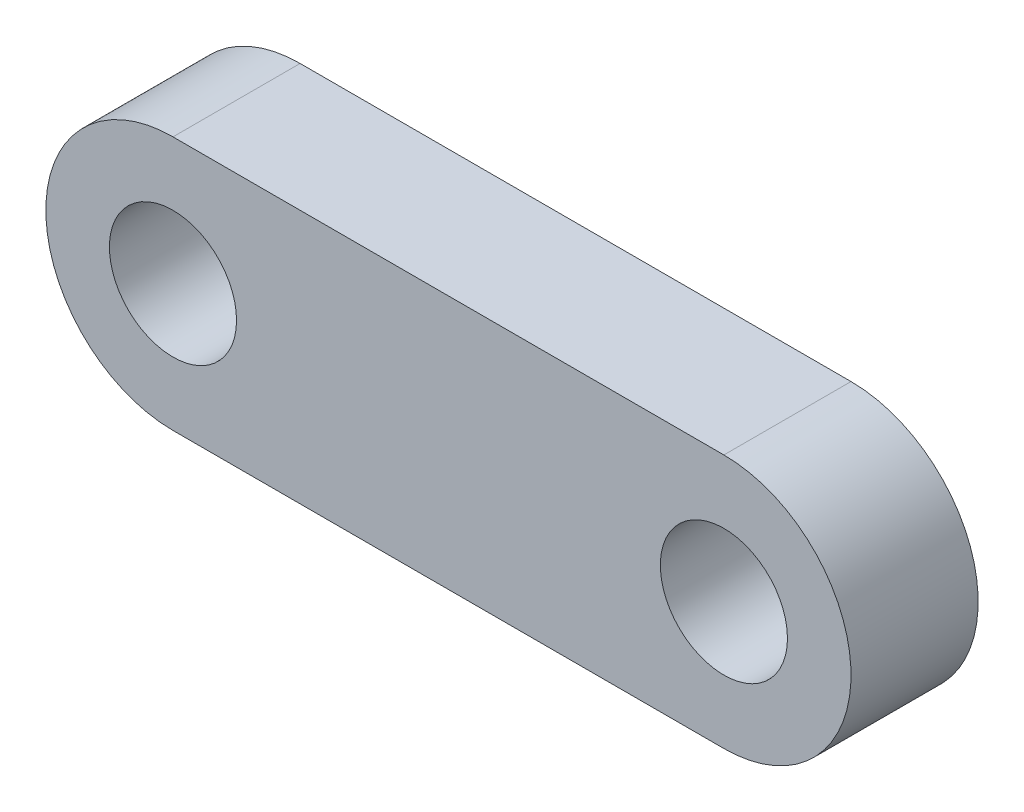
ISO-10303-21;
HEADER;
FILE_DESCRIPTION(('STEP AP214'),'2;1');
FILE_NAME('part.step','',(''),(''),'','','');
FILE_SCHEMA(('AUTOMOTIVE_DESIGN { 1 0 10303 214 1 1 1 1 }'));
ENDSEC;
DATA;
#1=APPLICATION_CONTEXT('core data for automotive mechanical design processes');
#2=APPLICATION_PROTOCOL_DEFINITION('international standard','automotive_design',2000,#1);
#3=PRODUCT_CONTEXT('',#1,'mechanical');
#4=PRODUCT('Part','Part','',(#3));
#5=PRODUCT_RELATED_PRODUCT_CATEGORY('part','',(#4));
#6=PRODUCT_DEFINITION_FORMATION('','',#4);
#7=PRODUCT_DEFINITION_CONTEXT('part definition',#1,'design');
#8=PRODUCT_DEFINITION('design','',#6,#7);
#9=PRODUCT_DEFINITION_SHAPE('','',#8);
#10=(LENGTH_UNIT() NAMED_UNIT(*) SI_UNIT(.MILLI.,.METRE.));
#11=(NAMED_UNIT(*) PLANE_ANGLE_UNIT() SI_UNIT($,.RADIAN.));
#12=(NAMED_UNIT(*) SI_UNIT($,.STERADIAN.) SOLID_ANGLE_UNIT());
#13=UNCERTAINTY_MEASURE_WITH_UNIT(LENGTH_MEASURE(1.E-05),#10,'distance_accuracy_value','');
#14=(GEOMETRIC_REPRESENTATION_CONTEXT(3) GLOBAL_UNCERTAINTY_ASSIGNED_CONTEXT((#13)) GLOBAL_UNIT_ASSIGNED_CONTEXT((#10,
#11,#12)) REPRESENTATION_CONTEXT('',''));
#15=CARTESIAN_POINT('',(0.,0.,0.));
#16=DIRECTION('',(0.,0.,1.));
#17=DIRECTION('',(1.,0.,0.));
#18=AXIS2_PLACEMENT_3D('',#15,#16,#17);
#19=CARTESIAN_POINT('',(0.,0.,1.5));
#20=DIRECTION('',(0.,0.,1.));
#21=DIRECTION('',(1.,0.,0.));
#22=AXIS2_PLACEMENT_3D('',#19,#20,#21);
#23=PLANE('',#22);
#24=CARTESIAN_POINT('',(-13.,0.,1.5));
#25=DIRECTION('',(0.,0.,1.));
#26=DIRECTION('',(1.,0.,0.));
#27=AXIS2_PLACEMENT_3D('',#24,#25,#26);
#28=CIRCLE('',#27,1.5);
#29=CARTESIAN_POINT('',(-11.5,0.,1.5));
#30=VERTEX_POINT('',#29);
#31=EDGE_CURVE('E102',#30,#30,#28,.T.);
#32=ORIENTED_EDGE('',*,*,#31,.F.);
#33=EDGE_LOOP('',(#32));
#34=FACE_BOUND('',#33,.T.);
#35=CARTESIAN_POINT('',(0.,0.,1.5));
#36=DIRECTION('',(0.,0.,1.));
#37=DIRECTION('',(1.,0.,0.));
#38=AXIS2_PLACEMENT_3D('',#35,#36,#37);
#39=CIRCLE('',#38,3.);
#40=CARTESIAN_POINT('',(0.,-3.,1.5));
#41=VERTEX_POINT('',#40);
#42=CARTESIAN_POINT('',(0.,3.,1.5));
#43=VERTEX_POINT('',#42);
#44=EDGE_CURVE('E87',#41,#43,#39,.T.);
#45=ORIENTED_EDGE('',*,*,#44,.T.);
#46=DIRECTION('',(-1.,0.,0.));
#47=VECTOR('',#46,1.);
#48=CARTESIAN_POINT('',(0.,3.,1.5));
#49=LINE('',#48,#47);
#50=CARTESIAN_POINT('',(-13.,3.,1.5));
#51=VERTEX_POINT('',#50);
#52=EDGE_CURVE('E82',#43,#51,#49,.T.);
#53=ORIENTED_EDGE('',*,*,#52,.T.);
#54=CARTESIAN_POINT('',(-13.,0.,1.5));
#55=DIRECTION('',(0.,0.,1.));
#56=DIRECTION('',(1.,0.,0.));
#57=AXIS2_PLACEMENT_3D('',#54,#55,#56);
#58=CIRCLE('',#57,3.);
#59=CARTESIAN_POINT('',(-13.,-3.,1.5));
#60=VERTEX_POINT('',#59);
#61=EDGE_CURVE('E85',#51,#60,#58,.T.);
#62=ORIENTED_EDGE('',*,*,#61,.T.);
#63=DIRECTION('',(1.,0.,0.));
#64=VECTOR('',#63,1.);
#65=CARTESIAN_POINT('',(0.,-3.,1.5));
#66=LINE('',#65,#64);
#67=EDGE_CURVE('E52',#60,#41,#66,.T.);
#68=ORIENTED_EDGE('',*,*,#67,.T.);
#69=EDGE_LOOP('',(#45,#53,#62,#68));
#70=FACE_BOUND('',#69,.T.);
#71=CARTESIAN_POINT('',(0.,0.,1.5));
#72=DIRECTION('',(0.,0.,1.));
#73=DIRECTION('',(1.,0.,0.));
#74=AXIS2_PLACEMENT_3D('',#71,#72,#73);
#75=CIRCLE('',#74,1.5);
#76=CARTESIAN_POINT('',(1.5,0.,1.5));
#77=VERTEX_POINT('',#76);
#78=EDGE_CURVE('E117',#77,#77,#75,.T.);
#79=ORIENTED_EDGE('',*,*,#78,.F.);
#80=EDGE_LOOP('',(#79));
#81=FACE_BOUND('',#80,.T.);
#82=ADVANCED_FACE('F35',(#34,#70,#81),#23,.T.);
#83=CARTESIAN_POINT('',(0.,0.,-1.5));
#84=DIRECTION('',(0.,0.,1.));
#85=DIRECTION('',(1.,0.,0.));
#86=AXIS2_PLACEMENT_3D('',#83,#84,#85);
#87=PLANE('',#86);
#88=CARTESIAN_POINT('',(0.,0.,-1.5));
#89=DIRECTION('',(0.,0.,1.));
#90=DIRECTION('',(1.,0.,0.));
#91=AXIS2_PLACEMENT_3D('',#88,#89,#90);
#92=CIRCLE('',#91,3.);
#93=CARTESIAN_POINT('',(0.,-3.,-1.5));
#94=VERTEX_POINT('',#93);
#95=CARTESIAN_POINT('',(0.,3.,-1.5));
#96=VERTEX_POINT('',#95);
#97=EDGE_CURVE('E99',#94,#96,#92,.T.);
#98=ORIENTED_EDGE('',*,*,#97,.F.);
#99=DIRECTION('',(1.,0.,0.));
#100=VECTOR('',#99,1.);
#101=CARTESIAN_POINT('',(0.,-3.,-1.5));
#102=LINE('',#101,#100);
#103=CARTESIAN_POINT('',(-13.,-3.,-1.5));
#104=VERTEX_POINT('',#103);
#105=EDGE_CURVE('E75',#104,#94,#102,.T.);
#106=ORIENTED_EDGE('',*,*,#105,.F.);
#107=CARTESIAN_POINT('',(-13.,0.,-1.5));
#108=DIRECTION('',(0.,0.,1.));
#109=DIRECTION('',(1.,0.,0.));
#110=AXIS2_PLACEMENT_3D('',#107,#108,#109);
#111=CIRCLE('',#110,3.);
#112=CARTESIAN_POINT('',(-13.,3.,-1.5));
#113=VERTEX_POINT('',#112);
#114=EDGE_CURVE('E69',#113,#104,#111,.T.);
#115=ORIENTED_EDGE('',*,*,#114,.F.);
#116=DIRECTION('',(-1.,0.,0.));
#117=VECTOR('',#116,1.);
#118=CARTESIAN_POINT('',(0.,3.,-1.5));
#119=LINE('',#118,#117);
#120=EDGE_CURVE('E91',#96,#113,#119,.T.);
#121=ORIENTED_EDGE('',*,*,#120,.F.);
#122=EDGE_LOOP('',(#98,#106,#115,#121));
#123=FACE_BOUND('',#122,.T.);
#124=CARTESIAN_POINT('',(-13.,0.,-1.5));
#125=DIRECTION('',(0.,0.,1.));
#126=DIRECTION('',(1.,0.,0.));
#127=AXIS2_PLACEMENT_3D('',#124,#125,#126);
#128=CIRCLE('',#127,1.5);
#129=CARTESIAN_POINT('',(-11.5,0.,-1.5));
#130=VERTEX_POINT('',#129);
#131=EDGE_CURVE('E114',#130,#130,#128,.T.);
#132=ORIENTED_EDGE('',*,*,#131,.T.);
#133=EDGE_LOOP('',(#132));
#134=FACE_BOUND('',#133,.T.);
#135=CARTESIAN_POINT('',(0.,0.,-1.5));
#136=DIRECTION('',(0.,0.,1.));
#137=DIRECTION('',(1.,0.,0.));
#138=AXIS2_PLACEMENT_3D('',#135,#136,#137);
#139=CIRCLE('',#138,1.5);
#140=CARTESIAN_POINT('',(1.5,0.,-1.5));
#141=VERTEX_POINT('',#140);
#142=EDGE_CURVE('E120',#141,#141,#139,.T.);
#143=ORIENTED_EDGE('',*,*,#142,.T.);
#144=EDGE_LOOP('',(#143));
#145=FACE_BOUND('',#144,.T.);
#146=ADVANCED_FACE('F110',(#123,#134,#145),#87,.F.);
#147=CARTESIAN_POINT('',(0.,0.,1.5));
#148=DIRECTION('',(0.,0.,-1.));
#149=DIRECTION('',(-1.,0.,0.));
#150=AXIS2_PLACEMENT_3D('',#147,#148,#149);
#151=CYLINDRICAL_SURFACE('',#150,3.);
#152=ORIENTED_EDGE('',*,*,#97,.T.);
#153=DIRECTION('',(0.,0.,-1.));
#154=VECTOR('',#153,1.);
#155=CARTESIAN_POINT('',(0.,3.,1.5));
#156=LINE('',#155,#154);
#157=EDGE_CURVE('E11',#43,#96,#156,.T.);
#158=ORIENTED_EDGE('',*,*,#157,.F.);
#159=ORIENTED_EDGE('',*,*,#44,.F.);
#160=DIRECTION('',(0.,0.,-1.));
#161=VECTOR('',#160,1.);
#162=CARTESIAN_POINT('',(0.,-3.,1.5));
#163=LINE('',#162,#161);
#164=EDGE_CURVE('E95',#41,#94,#163,.T.);
#165=ORIENTED_EDGE('',*,*,#164,.T.);
#166=EDGE_LOOP('',(#152,#158,#159,#165));
#167=FACE_BOUND('',#166,.T.);
#168=ADVANCED_FACE('F37',(#167),#151,.T.);
#169=CARTESIAN_POINT('',(0.,3.,1.5));
#170=DIRECTION('',(0.,-1.,0.));
#171=DIRECTION('',(1.,0.,0.));
#172=AXIS2_PLACEMENT_3D('',#169,#170,#171);
#173=PLANE('',#172);
#174=ORIENTED_EDGE('',*,*,#120,.T.);
#175=DIRECTION('',(0.,0.,-1.));
#176=VECTOR('',#175,1.);
#177=CARTESIAN_POINT('',(-13.,3.,1.5));
#178=LINE('',#177,#176);
#179=EDGE_CURVE('E44',#51,#113,#178,.T.);
#180=ORIENTED_EDGE('',*,*,#179,.F.);
#181=ORIENTED_EDGE('',*,*,#52,.F.);
#182=ORIENTED_EDGE('',*,*,#157,.T.);
#183=EDGE_LOOP('',(#174,#180,#181,#182));
#184=FACE_BOUND('',#183,.T.);
#185=ADVANCED_FACE('F90',(#184),#173,.F.);
#186=CARTESIAN_POINT('',(-13.,0.,1.5));
#187=DIRECTION('',(0.,0.,-1.));
#188=DIRECTION('',(-1.,0.,0.));
#189=AXIS2_PLACEMENT_3D('',#186,#187,#188);
#190=CYLINDRICAL_SURFACE('',#189,3.);
#191=ORIENTED_EDGE('',*,*,#114,.T.);
#192=DIRECTION('',(0.,0.,-1.));
#193=VECTOR('',#192,1.);
#194=CARTESIAN_POINT('',(-13.,-3.,1.5));
#195=LINE('',#194,#193);
#196=EDGE_CURVE('E92',#60,#104,#195,.T.);
#197=ORIENTED_EDGE('',*,*,#196,.F.);
#198=ORIENTED_EDGE('',*,*,#61,.F.);
#199=ORIENTED_EDGE('',*,*,#179,.T.);
#200=EDGE_LOOP('',(#191,#197,#198,#199));
#201=FACE_BOUND('',#200,.T.);
#202=ADVANCED_FACE('F93',(#201),#190,.T.);
#203=CARTESIAN_POINT('',(0.,-3.,1.5));
#204=DIRECTION('',(0.,1.,0.));
#205=DIRECTION('',(-1.,0.,0.));
#206=AXIS2_PLACEMENT_3D('',#203,#204,#205);
#207=PLANE('',#206);
#208=ORIENTED_EDGE('',*,*,#105,.T.);
#209=ORIENTED_EDGE('',*,*,#164,.F.);
#210=ORIENTED_EDGE('',*,*,#67,.F.);
#211=ORIENTED_EDGE('',*,*,#196,.T.);
#212=EDGE_LOOP('',(#208,#209,#210,#211));
#213=FACE_BOUND('',#212,.T.);
#214=ADVANCED_FACE('F107',(#213),#207,.F.);
#215=CARTESIAN_POINT('',(-13.,0.,1.5));
#216=DIRECTION('',(0.,0.,-1.));
#217=DIRECTION('',(-1.,0.,0.));
#218=AXIS2_PLACEMENT_3D('',#215,#216,#217);
#219=CYLINDRICAL_SURFACE('',#218,1.5);
#220=ORIENTED_EDGE('',*,*,#31,.T.);
#221=EDGE_LOOP('',(#220));
#222=FACE_BOUND('',#221,.T.);
#223=ORIENTED_EDGE('',*,*,#131,.F.);
#224=EDGE_LOOP('',(#223));
#225=FACE_BOUND('',#224,.T.);
#226=ADVANCED_FACE('F137',(#222,#225),#219,.F.);
#227=CARTESIAN_POINT('',(0.,0.,1.5));
#228=DIRECTION('',(0.,0.,-1.));
#229=DIRECTION('',(-1.,0.,0.));
#230=AXIS2_PLACEMENT_3D('',#227,#228,#229);
#231=CYLINDRICAL_SURFACE('',#230,1.5);
#232=ORIENTED_EDGE('',*,*,#78,.T.);
#233=EDGE_LOOP('',(#232));
#234=FACE_BOUND('',#233,.T.);
#235=ORIENTED_EDGE('',*,*,#142,.F.);
#236=EDGE_LOOP('',(#235));
#237=FACE_BOUND('',#236,.T.);
#238=ADVANCED_FACE('F126',(#234,#237),#231,.F.);
#239=CLOSED_SHELL('',(#82,#146,#168,#185,#202,#214,#226,#238));
#240=MANIFOLD_SOLID_BREP('B2',#239);
#241=ADVANCED_BREP_SHAPE_REPRESENTATION('',(#18,#240),#14);
#242=SHAPE_DEFINITION_REPRESENTATION(#9,#241);
ENDSEC;
END-ISO-10303-21;
